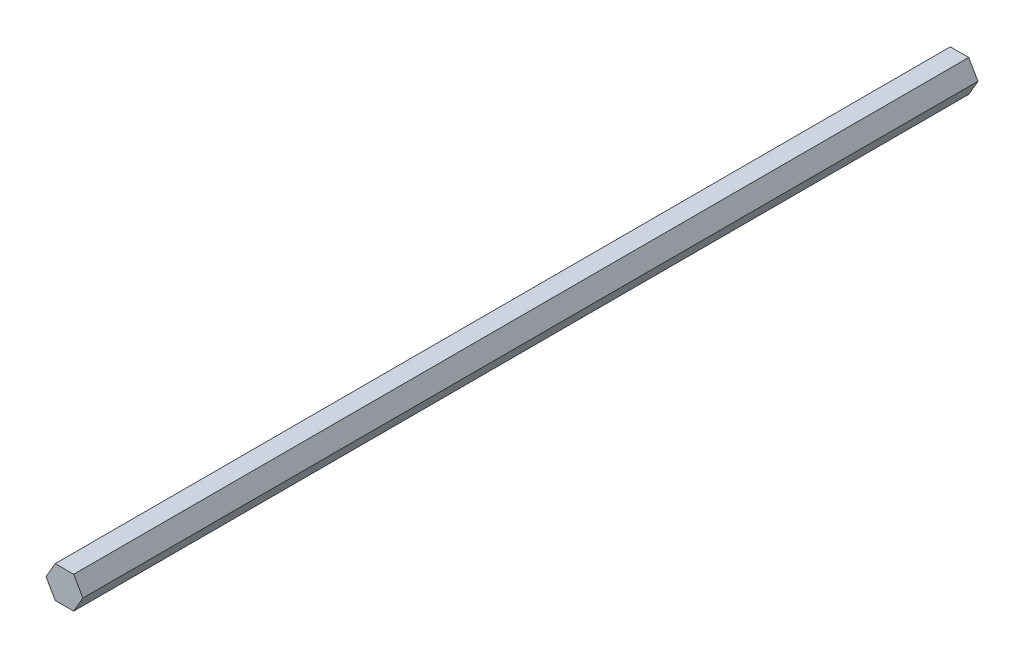
ISO-10303-21;
HEADER;
FILE_DESCRIPTION(('STEP AP214'),'2;1');
FILE_NAME('part.step','',(''),(''),'','','');
FILE_SCHEMA(('AUTOMOTIVE_DESIGN { 1 0 10303 214 1 1 1 1 }'));
ENDSEC;
DATA;
#1=APPLICATION_CONTEXT('core data for automotive mechanical design processes');
#2=APPLICATION_PROTOCOL_DEFINITION('international standard','automotive_design',2000,#1);
#3=PRODUCT_CONTEXT('',#1,'mechanical');
#4=PRODUCT('Part','Part','',(#3));
#5=PRODUCT_RELATED_PRODUCT_CATEGORY('part','',(#4));
#6=PRODUCT_DEFINITION_FORMATION('','',#4);
#7=PRODUCT_DEFINITION_CONTEXT('part definition',#1,'design');
#8=PRODUCT_DEFINITION('design','',#6,#7);
#9=PRODUCT_DEFINITION_SHAPE('','',#8);
#10=(LENGTH_UNIT() NAMED_UNIT(*) SI_UNIT(.MILLI.,.METRE.));
#11=(NAMED_UNIT(*) PLANE_ANGLE_UNIT() SI_UNIT($,.RADIAN.));
#12=(NAMED_UNIT(*) SI_UNIT($,.STERADIAN.) SOLID_ANGLE_UNIT());
#13=UNCERTAINTY_MEASURE_WITH_UNIT(LENGTH_MEASURE(1.E-05),#10,'distance_accuracy_value','');
#14=(GEOMETRIC_REPRESENTATION_CONTEXT(3) GLOBAL_UNCERTAINTY_ASSIGNED_CONTEXT((#13)) GLOBAL_UNIT_ASSIGNED_CONTEXT((#10,
#11,#12)) REPRESENTATION_CONTEXT('',''));
#15=CARTESIAN_POINT('',(0.,0.,0.));
#16=DIRECTION('',(0.,0.,1.));
#17=DIRECTION('',(1.,0.,0.));
#18=AXIS2_PLACEMENT_3D('',#15,#16,#17);
#19=CARTESIAN_POINT('',(7.33234841870825,0.,355.6));
#20=DIRECTION('',(-0.866025403784438,-0.5,0.));
#21=DIRECTION('',(0.5,-0.866025403784438,0.));
#22=AXIS2_PLACEMENT_3D('',#19,#20,#21);
#23=PLANE('',#22);
#24=DIRECTION('',(-0.5,0.866025403784438,0.));
#25=VECTOR('',#24,1.);
#26=CARTESIAN_POINT('',(7.33234841870825,0.,0.));
#27=LINE('',#26,#25);
#28=CARTESIAN_POINT('',(7.33234841870825,0.,0.));
#29=VERTEX_POINT('',#28);
#30=CARTESIAN_POINT('',(3.66617420935412,6.35,0.));
#31=VERTEX_POINT('',#30);
#32=EDGE_CURVE('E144',#29,#31,#27,.T.);
#33=ORIENTED_EDGE('',*,*,#32,.T.);
#34=DIRECTION('',(0.,0.,-1.));
#35=VECTOR('',#34,1.);
#36=CARTESIAN_POINT('',(3.66617420935412,6.35,355.6));
#37=LINE('',#36,#35);
#38=CARTESIAN_POINT('',(3.66617420935412,6.35,355.6));
#39=VERTEX_POINT('',#38);
#40=EDGE_CURVE('E11',#39,#31,#37,.T.);
#41=ORIENTED_EDGE('',*,*,#40,.F.);
#42=DIRECTION('',(-0.5,0.866025403784438,0.));
#43=VECTOR('',#42,1.);
#44=CARTESIAN_POINT('',(7.33234841870825,0.,355.6));
#45=LINE('',#44,#43);
#46=CARTESIAN_POINT('',(7.33234841870825,0.,355.6));
#47=VERTEX_POINT('',#46);
#48=EDGE_CURVE('E160',#47,#39,#45,.T.);
#49=ORIENTED_EDGE('',*,*,#48,.F.);
#50=DIRECTION('',(0.,0.,-1.));
#51=VECTOR('',#50,1.);
#52=CARTESIAN_POINT('',(7.33234841870825,0.,355.6));
#53=LINE('',#52,#51);
#54=EDGE_CURVE('E140',#47,#29,#53,.T.);
#55=ORIENTED_EDGE('',*,*,#54,.T.);
#56=EDGE_LOOP('',(#33,#41,#49,#55));
#57=FACE_BOUND('',#56,.T.);
#58=ADVANCED_FACE('F49',(#57),#23,.F.);
#59=CARTESIAN_POINT('',(3.66617420935412,6.35,355.6));
#60=DIRECTION('',(0.,-1.,0.));
#61=DIRECTION('',(1.,0.,0.));
#62=AXIS2_PLACEMENT_3D('',#59,#60,#61);
#63=PLANE('',#62);
#64=DIRECTION('',(-1.,0.,0.));
#65=VECTOR('',#64,1.);
#66=CARTESIAN_POINT('',(3.66617420935412,6.35,0.));
#67=LINE('',#66,#65);
#68=CARTESIAN_POINT('',(-3.66617420935413,6.35,0.));
#69=VERTEX_POINT('',#68);
#70=EDGE_CURVE('E148',#31,#69,#67,.T.);
#71=ORIENTED_EDGE('',*,*,#70,.T.);
#72=DIRECTION('',(0.,0.,-1.));
#73=VECTOR('',#72,1.);
#74=CARTESIAN_POINT('',(-3.66617420935413,6.35,355.6));
#75=LINE('',#74,#73);
#76=CARTESIAN_POINT('',(-3.66617420935413,6.35,355.6));
#77=VERTEX_POINT('',#76);
#78=EDGE_CURVE('E58',#77,#69,#75,.T.);
#79=ORIENTED_EDGE('',*,*,#78,.F.);
#80=DIRECTION('',(-1.,0.,0.));
#81=VECTOR('',#80,1.);
#82=CARTESIAN_POINT('',(3.66617420935412,6.35,355.6));
#83=LINE('',#82,#81);
#84=EDGE_CURVE('E107',#39,#77,#83,.T.);
#85=ORIENTED_EDGE('',*,*,#84,.F.);
#86=ORIENTED_EDGE('',*,*,#40,.T.);
#87=EDGE_LOOP('',(#71,#79,#85,#86));
#88=FACE_BOUND('',#87,.T.);
#89=ADVANCED_FACE('F188',(#88),#63,.F.);
#90=CARTESIAN_POINT('',(-3.66617420935413,6.35,355.6));
#91=DIRECTION('',(0.866025403784439,-0.5,0.));
#92=DIRECTION('',(0.5,0.866025403784439,0.));
#93=AXIS2_PLACEMENT_3D('',#90,#91,#92);
#94=PLANE('',#93);
#95=DIRECTION('',(-0.5,-0.866025403784439,0.));
#96=VECTOR('',#95,1.);
#97=CARTESIAN_POINT('',(-3.66617420935413,6.35,0.));
#98=LINE('',#97,#96);
#99=CARTESIAN_POINT('',(-7.33234841870825,0.,0.));
#100=VERTEX_POINT('',#99);
#101=EDGE_CURVE('E151',#69,#100,#98,.T.);
#102=ORIENTED_EDGE('',*,*,#101,.T.);
#103=DIRECTION('',(0.,0.,-1.));
#104=VECTOR('',#103,1.);
#105=CARTESIAN_POINT('',(-7.33234841870825,0.,355.6));
#106=LINE('',#105,#104);
#107=CARTESIAN_POINT('',(-7.33234841870825,0.,355.6));
#108=VERTEX_POINT('',#107);
#109=EDGE_CURVE('E133',#108,#100,#106,.T.);
#110=ORIENTED_EDGE('',*,*,#109,.F.);
#111=DIRECTION('',(-0.5,-0.866025403784439,0.));
#112=VECTOR('',#111,1.);
#113=CARTESIAN_POINT('',(-3.66617420935413,6.35,355.6));
#114=LINE('',#113,#112);
#115=EDGE_CURVE('E122',#77,#108,#114,.T.);
#116=ORIENTED_EDGE('',*,*,#115,.F.);
#117=ORIENTED_EDGE('',*,*,#78,.T.);
#118=EDGE_LOOP('',(#102,#110,#116,#117));
#119=FACE_BOUND('',#118,.T.);
#120=ADVANCED_FACE('F170',(#119),#94,.F.);
#121=CARTESIAN_POINT('',(-7.33234841870825,0.,355.6));
#122=DIRECTION('',(0.866025403784439,0.5,0.));
#123=DIRECTION('',(-0.5,0.866025403784439,0.));
#124=AXIS2_PLACEMENT_3D('',#121,#122,#123);
#125=PLANE('',#124);
#126=DIRECTION('',(0.5,-0.866025403784438,0.));
#127=VECTOR('',#126,1.);
#128=CARTESIAN_POINT('',(-7.33234841870825,0.,0.));
#129=LINE('',#128,#127);
#130=CARTESIAN_POINT('',(-3.66617420935412,-6.35,0.));
#131=VERTEX_POINT('',#130);
#132=EDGE_CURVE('E131',#100,#131,#129,.T.);
#133=ORIENTED_EDGE('',*,*,#132,.T.);
#134=DIRECTION('',(0.,0.,-1.));
#135=VECTOR('',#134,1.);
#136=CARTESIAN_POINT('',(-3.66617420935412,-6.35,355.6));
#137=LINE('',#136,#135);
#138=CARTESIAN_POINT('',(-3.66617420935412,-6.35,355.6));
#139=VERTEX_POINT('',#138);
#140=EDGE_CURVE('E128',#139,#131,#137,.T.);
#141=ORIENTED_EDGE('',*,*,#140,.F.);
#142=DIRECTION('',(0.5,-0.866025403784438,0.));
#143=VECTOR('',#142,1.);
#144=CARTESIAN_POINT('',(-7.33234841870825,0.,355.6));
#145=LINE('',#144,#143);
#146=EDGE_CURVE('E116',#108,#139,#145,.T.);
#147=ORIENTED_EDGE('',*,*,#146,.F.);
#148=ORIENTED_EDGE('',*,*,#109,.T.);
#149=EDGE_LOOP('',(#133,#141,#147,#148));
#150=FACE_BOUND('',#149,.T.);
#151=ADVANCED_FACE('F129',(#150),#125,.F.);
#152=CARTESIAN_POINT('',(-3.66617420935412,-6.35,355.6));
#153=DIRECTION('',(0.,1.,0.));
#154=DIRECTION('',(0.,0.,1.));
#155=AXIS2_PLACEMENT_3D('',#152,#153,#154);
#156=PLANE('',#155);
#157=DIRECTION('',(1.,0.,0.));
#158=VECTOR('',#157,1.);
#159=CARTESIAN_POINT('',(-3.66617420935412,-6.35,0.));
#160=LINE('',#159,#158);
#161=CARTESIAN_POINT('',(3.66617420935412,-6.35,0.));
#162=VERTEX_POINT('',#161);
#163=EDGE_CURVE('E93',#131,#162,#160,.T.);
#164=ORIENTED_EDGE('',*,*,#163,.T.);
#165=DIRECTION('',(0.,0.,-1.));
#166=VECTOR('',#165,1.);
#167=CARTESIAN_POINT('',(3.66617420935412,-6.35,355.6));
#168=LINE('',#167,#166);
#169=CARTESIAN_POINT('',(3.66617420935412,-6.35,355.6));
#170=VERTEX_POINT('',#169);
#171=EDGE_CURVE('E134',#170,#162,#168,.T.);
#172=ORIENTED_EDGE('',*,*,#171,.F.);
#173=DIRECTION('',(1.,0.,0.));
#174=VECTOR('',#173,1.);
#175=CARTESIAN_POINT('',(-3.66617420935412,-6.35,355.6));
#176=LINE('',#175,#174);
#177=EDGE_CURVE('E120',#139,#170,#176,.T.);
#178=ORIENTED_EDGE('',*,*,#177,.F.);
#179=ORIENTED_EDGE('',*,*,#140,.T.);
#180=EDGE_LOOP('',(#164,#172,#178,#179));
#181=FACE_BOUND('',#180,.T.);
#182=ADVANCED_FACE('F136',(#181),#156,.F.);
#183=CARTESIAN_POINT('',(3.66617420935412,-6.35,355.6));
#184=DIRECTION('',(-0.866025403784438,0.5,0.));
#185=DIRECTION('',(-0.5,-0.866025403784439,0.));
#186=AXIS2_PLACEMENT_3D('',#183,#184,#185);
#187=PLANE('',#186);
#188=DIRECTION('',(0.5,0.866025403784438,0.));
#189=VECTOR('',#188,1.);
#190=CARTESIAN_POINT('',(3.66617420935412,-6.35,0.));
#191=LINE('',#190,#189);
#192=EDGE_CURVE('E99',#162,#29,#191,.T.);
#193=ORIENTED_EDGE('',*,*,#192,.T.);
#194=ORIENTED_EDGE('',*,*,#54,.F.);
#195=DIRECTION('',(0.5,0.866025403784438,0.));
#196=VECTOR('',#195,1.);
#197=CARTESIAN_POINT('',(3.66617420935412,-6.35,355.6));
#198=LINE('',#197,#196);
#199=EDGE_CURVE('E69',#170,#47,#198,.T.);
#200=ORIENTED_EDGE('',*,*,#199,.F.);
#201=ORIENTED_EDGE('',*,*,#171,.T.);
#202=EDGE_LOOP('',(#193,#194,#200,#201));
#203=FACE_BOUND('',#202,.T.);
#204=ADVANCED_FACE('F177',(#203),#187,.F.);
#205=CARTESIAN_POINT('',(0.,0.,355.6));
#206=DIRECTION('',(0.,0.,1.));
#207=DIRECTION('',(1.,0.,0.));
#208=AXIS2_PLACEMENT_3D('',#205,#206,#207);
#209=PLANE('',#208);
#210=ORIENTED_EDGE('',*,*,#48,.T.);
#211=ORIENTED_EDGE('',*,*,#84,.T.);
#212=ORIENTED_EDGE('',*,*,#115,.T.);
#213=ORIENTED_EDGE('',*,*,#146,.T.);
#214=ORIENTED_EDGE('',*,*,#177,.T.);
#215=ORIENTED_EDGE('',*,*,#199,.T.);
#216=EDGE_LOOP('',(#210,#211,#212,#213,#214,#215));
#217=FACE_BOUND('',#216,.T.);
#218=ADVANCED_FACE('F118',(#217),#209,.T.);
#219=CARTESIAN_POINT('',(0.,0.,0.));
#220=DIRECTION('',(0.,0.,1.));
#221=DIRECTION('',(1.,0.,0.));
#222=AXIS2_PLACEMENT_3D('',#219,#220,#221);
#223=PLANE('',#222);
#224=ORIENTED_EDGE('',*,*,#32,.F.);
#225=ORIENTED_EDGE('',*,*,#192,.F.);
#226=ORIENTED_EDGE('',*,*,#163,.F.);
#227=ORIENTED_EDGE('',*,*,#132,.F.);
#228=ORIENTED_EDGE('',*,*,#101,.F.);
#229=ORIENTED_EDGE('',*,*,#70,.F.);
#230=EDGE_LOOP('',(#224,#225,#226,#227,#228,#229));
#231=FACE_BOUND('',#230,.T.);
#232=ADVANCED_FACE('F173',(#231),#223,.F.);
#233=CLOSED_SHELL('',(#58,#89,#120,#151,#182,#204,#218,#232));
#234=MANIFOLD_SOLID_BREP('B2',#233);
#235=ADVANCED_BREP_SHAPE_REPRESENTATION('',(#18,#234),#14);
#236=SHAPE_DEFINITION_REPRESENTATION(#9,#235);
ENDSEC;
END-ISO-10303-21;
